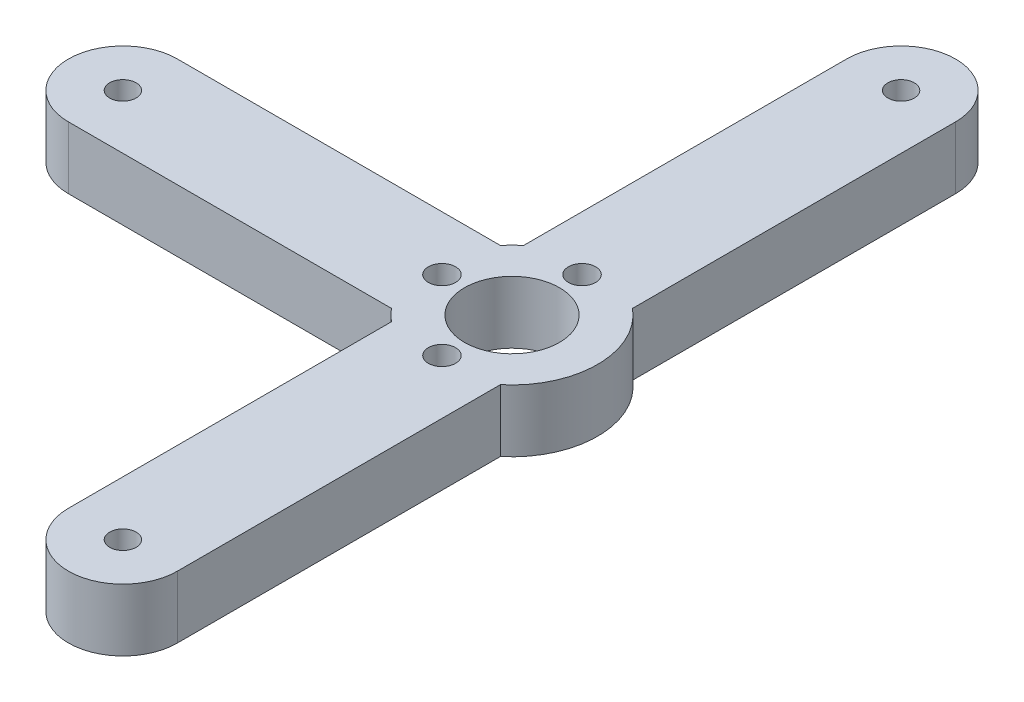
ISO-10303-21;
HEADER;
FILE_DESCRIPTION(('STEP AP214'),'2;1');
FILE_NAME('part.step','',(''),(''),'','','');
FILE_SCHEMA(('AUTOMOTIVE_DESIGN { 1 0 10303 214 1 1 1 1 }'));
ENDSEC;
DATA;
#1=APPLICATION_CONTEXT('core data for automotive mechanical design processes');
#2=APPLICATION_PROTOCOL_DEFINITION('international standard','automotive_design',2000,#1);
#3=PRODUCT_CONTEXT('',#1,'mechanical');
#4=PRODUCT('Part','Part','',(#3));
#5=PRODUCT_RELATED_PRODUCT_CATEGORY('part','',(#4));
#6=PRODUCT_DEFINITION_FORMATION('','',#4);
#7=PRODUCT_DEFINITION_CONTEXT('part definition',#1,'design');
#8=PRODUCT_DEFINITION('design','',#6,#7);
#9=PRODUCT_DEFINITION_SHAPE('','',#8);
#10=(LENGTH_UNIT() NAMED_UNIT(*) SI_UNIT(.MILLI.,.METRE.));
#11=(NAMED_UNIT(*) PLANE_ANGLE_UNIT() SI_UNIT($,.RADIAN.));
#12=(NAMED_UNIT(*) SI_UNIT($,.STERADIAN.) SOLID_ANGLE_UNIT());
#13=UNCERTAINTY_MEASURE_WITH_UNIT(LENGTH_MEASURE(1.E-05),#10,'distance_accuracy_value','');
#14=(GEOMETRIC_REPRESENTATION_CONTEXT(3) GLOBAL_UNCERTAINTY_ASSIGNED_CONTEXT((#13)) GLOBAL_UNIT_ASSIGNED_CONTEXT((#10,
#11,#12)) REPRESENTATION_CONTEXT('',''));
#15=CARTESIAN_POINT('',(0.,0.,0.));
#16=DIRECTION('',(0.,0.,1.));
#17=DIRECTION('',(1.,0.,0.));
#18=AXIS2_PLACEMENT_3D('',#15,#16,#17);
#19=CARTESIAN_POINT('',(-56.2916512459885,150.6,0.));
#20=DIRECTION('',(0.,-1.,0.));
#21=DIRECTION('',(0.,0.,-1.));
#22=AXIS2_PLACEMENT_3D('',#19,#20,#21);
#23=PLANE('',#22);
#24=CARTESIAN_POINT('',(-106.291651245989,150.6,0.));
#25=DIRECTION('',(0.,1.,0.));
#26=DIRECTION('',(0.,0.,1.));
#27=AXIS2_PLACEMENT_3D('',#24,#25,#26);
#28=CIRCLE('',#27,1.69999999999999);
#29=CARTESIAN_POINT('',(-106.291651245989,150.6,1.69999999999999));
#30=VERTEX_POINT('',#29);
#31=EDGE_CURVE('E200',#30,#30,#28,.T.);
#32=ORIENTED_EDGE('',*,*,#31,.T.);
#33=EDGE_LOOP('',(#32));
#34=FACE_BOUND('',#33,.T.);
#35=CARTESIAN_POINT('',(-106.291651245989,150.6,0.));
#36=DIRECTION('',(0.,1.,0.));
#37=DIRECTION('',(0.,0.,1.));
#38=AXIS2_PLACEMENT_3D('',#35,#36,#37);
#39=CIRCLE('',#38,3.10000000000001);
#40=CARTESIAN_POINT('',(-106.291651245989,150.6,3.10000000000001));
#41=VERTEX_POINT('',#40);
#42=EDGE_CURVE('E210',#41,#41,#39,.T.);
#43=ORIENTED_EDGE('',*,*,#42,.F.);
#44=EDGE_LOOP('',(#43));
#45=FACE_BOUND('',#44,.T.);
#46=ADVANCED_FACE('F41',(#34,#45),#23,.T.);
#47=CARTESIAN_POINT('',(-56.2916512459885,150.6,-50.));
#48=DIRECTION('',(0.,1.,0.));
#49=DIRECTION('',(0.,0.,1.));
#50=AXIS2_PLACEMENT_3D('',#47,#48,#49);
#51=CIRCLE('',#50,1.7);
#52=CARTESIAN_POINT('',(-56.2916512459885,150.6,-48.3));
#53=VERTEX_POINT('',#52);
#54=EDGE_CURVE('E198',#53,#53,#51,.T.);
#55=ORIENTED_EDGE('',*,*,#54,.T.);
#56=EDGE_LOOP('',(#55));
#57=FACE_BOUND('',#56,.T.);
#58=CARTESIAN_POINT('',(-56.2916512459885,150.6,-50.));
#59=DIRECTION('',(0.,1.,0.));
#60=DIRECTION('',(0.,0.,1.));
#61=AXIS2_PLACEMENT_3D('',#58,#59,#60);
#62=CIRCLE('',#61,3.1);
#63=CARTESIAN_POINT('',(-56.2916512459885,150.6,-46.9));
#64=VERTEX_POINT('',#63);
#65=EDGE_CURVE('E216',#64,#64,#62,.T.);
#66=ORIENTED_EDGE('',*,*,#65,.F.);
#67=EDGE_LOOP('',(#66));
#68=FACE_BOUND('',#67,.T.);
#69=ADVANCED_FACE('F329',(#57,#68),#23,.T.);
#70=CARTESIAN_POINT('',(-56.2916512459885,150.6,50.));
#71=DIRECTION('',(0.,1.,0.));
#72=DIRECTION('',(0.,0.,1.));
#73=AXIS2_PLACEMENT_3D('',#70,#71,#72);
#74=CIRCLE('',#73,1.7);
#75=CARTESIAN_POINT('',(-56.2916512459885,150.6,51.7));
#76=VERTEX_POINT('',#75);
#77=EDGE_CURVE('E193',#76,#76,#74,.T.);
#78=ORIENTED_EDGE('',*,*,#77,.T.);
#79=EDGE_LOOP('',(#78));
#80=FACE_BOUND('',#79,.T.);
#81=CARTESIAN_POINT('',(-56.2916512459885,150.6,50.));
#82=DIRECTION('',(0.,1.,0.));
#83=DIRECTION('',(0.,0.,1.));
#84=AXIS2_PLACEMENT_3D('',#81,#82,#83);
#85=CIRCLE('',#84,3.1);
#86=CARTESIAN_POINT('',(-56.2916512459885,150.6,53.1));
#87=VERTEX_POINT('',#86);
#88=EDGE_CURVE('E205',#87,#87,#85,.T.);
#89=ORIENTED_EDGE('',*,*,#88,.F.);
#90=EDGE_LOOP('',(#89));
#91=FACE_BOUND('',#90,.T.);
#92=ADVANCED_FACE('F334',(#80,#91),#23,.T.);
#93=CARTESIAN_POINT('',(-106.291651245989,153.,0.));
#94=DIRECTION('',(0.,-1.,0.));
#95=DIRECTION('',(0.,0.,-1.));
#96=AXIS2_PLACEMENT_3D('',#93,#94,#95);
#97=CYLINDRICAL_SURFACE('',#96,1.69999999999999);
#98=ORIENTED_EDGE('',*,*,#31,.F.);
#99=EDGE_LOOP('',(#98));
#100=FACE_BOUND('',#99,.T.);
#101=CARTESIAN_POINT('',(-106.291651245989,157.,0.));
#102=DIRECTION('',(0.,1.,0.));
#103=DIRECTION('',(0.,0.,1.));
#104=AXIS2_PLACEMENT_3D('',#101,#102,#103);
#105=CIRCLE('',#104,1.69999999999999);
#106=CARTESIAN_POINT('',(-106.291651245989,157.,1.69999999999999));
#107=VERTEX_POINT('',#106);
#108=EDGE_CURVE('E155',#107,#107,#105,.T.);
#109=ORIENTED_EDGE('',*,*,#108,.T.);
#110=EDGE_LOOP('',(#109));
#111=FACE_BOUND('',#110,.T.);
#112=ADVANCED_FACE('F343',(#100,#111),#97,.F.);
#113=CARTESIAN_POINT('',(-56.2916512459885,153.,-50.));
#114=DIRECTION('',(0.,-1.,0.));
#115=DIRECTION('',(0.,0.,-1.));
#116=AXIS2_PLACEMENT_3D('',#113,#114,#115);
#117=CYLINDRICAL_SURFACE('',#116,1.7);
#118=ORIENTED_EDGE('',*,*,#54,.F.);
#119=EDGE_LOOP('',(#118));
#120=FACE_BOUND('',#119,.T.);
#121=CARTESIAN_POINT('',(-56.2916512459885,157.,-50.));
#122=DIRECTION('',(0.,1.,0.));
#123=DIRECTION('',(0.,0.,1.));
#124=AXIS2_PLACEMENT_3D('',#121,#122,#123);
#125=CIRCLE('',#124,1.7);
#126=CARTESIAN_POINT('',(-56.2916512459885,157.,-48.3));
#127=VERTEX_POINT('',#126);
#128=EDGE_CURVE('E154',#127,#127,#125,.T.);
#129=ORIENTED_EDGE('',*,*,#128,.T.);
#130=EDGE_LOOP('',(#129));
#131=FACE_BOUND('',#130,.T.);
#132=ADVANCED_FACE('F349',(#120,#131),#117,.F.);
#133=CARTESIAN_POINT('',(-56.2916512459885,153.,50.));
#134=DIRECTION('',(0.,-1.,0.));
#135=DIRECTION('',(0.,0.,-1.));
#136=AXIS2_PLACEMENT_3D('',#133,#134,#135);
#137=CYLINDRICAL_SURFACE('',#136,1.7);
#138=ORIENTED_EDGE('',*,*,#77,.F.);
#139=EDGE_LOOP('',(#138));
#140=FACE_BOUND('',#139,.T.);
#141=CARTESIAN_POINT('',(-56.2916512459885,157.,50.));
#142=DIRECTION('',(0.,1.,0.));
#143=DIRECTION('',(0.,0.,1.));
#144=AXIS2_PLACEMENT_3D('',#141,#142,#143);
#145=CIRCLE('',#144,1.7);
#146=CARTESIAN_POINT('',(-56.2916512459885,157.,51.7));
#147=VERTEX_POINT('',#146);
#148=EDGE_CURVE('E420',#147,#147,#145,.T.);
#149=ORIENTED_EDGE('',*,*,#148,.T.);
#150=EDGE_LOOP('',(#149));
#151=FACE_BOUND('',#150,.T.);
#152=ADVANCED_FACE('F324',(#140,#151),#137,.F.);
#153=CARTESIAN_POINT('',(-106.291651245989,150.,0.));
#154=DIRECTION('',(0.,-1.,0.));
#155=DIRECTION('',(0.,0.,-1.));
#156=AXIS2_PLACEMENT_3D('',#153,#154,#155);
#157=CYLINDRICAL_SURFACE('',#156,3.10000000000001);
#158=CARTESIAN_POINT('',(-106.291651245989,149.,0.));
#159=DIRECTION('',(0.,1.,0.));
#160=DIRECTION('',(0.,0.,1.));
#161=AXIS2_PLACEMENT_3D('',#158,#159,#160);
#162=CIRCLE('',#161,3.10000000000001);
#163=CARTESIAN_POINT('',(-106.291651245989,149.,3.10000000000001));
#164=VERTEX_POINT('',#163);
#165=EDGE_CURVE('E228',#164,#164,#162,.T.);
#166=ORIENTED_EDGE('',*,*,#165,.F.);
#167=EDGE_LOOP('',(#166));
#168=FACE_BOUND('',#167,.T.);
#169=ORIENTED_EDGE('',*,*,#42,.T.);
#170=EDGE_LOOP('',(#169));
#171=FACE_BOUND('',#170,.T.);
#172=ADVANCED_FACE('F320',(#168,#171),#157,.F.);
#173=CARTESIAN_POINT('',(-64.776932620227,150.,7.));
#174=DIRECTION('',(0.,0.,-1.));
#175=DIRECTION('',(-1.,0.,0.));
#176=AXIS2_PLACEMENT_3D('',#173,#174,#175);
#177=PLANE('',#176);
#178=DIRECTION('',(1.,0.,0.));
#179=VECTOR('',#178,1.);
#180=CARTESIAN_POINT('',(-64.776932620227,149.,7.));
#181=LINE('',#180,#179);
#182=CARTESIAN_POINT('',(-106.291651245989,149.,7.));
#183=VERTEX_POINT('',#182);
#184=CARTESIAN_POINT('',(-64.776932620227,149.,7.));
#185=VERTEX_POINT('',#184);
#186=EDGE_CURVE('E57',#183,#185,#181,.T.);
#187=ORIENTED_EDGE('',*,*,#186,.T.);
#188=DIRECTION('',(0.,-1.,0.));
#189=VECTOR('',#188,1.);
#190=CARTESIAN_POINT('',(-64.776932620227,150.,7.));
#191=LINE('',#190,#189);
#192=CARTESIAN_POINT('',(-64.776932620227,157.,7.));
#193=VERTEX_POINT('',#192);
#194=EDGE_CURVE('E251',#193,#185,#191,.T.);
#195=ORIENTED_EDGE('',*,*,#194,.F.);
#196=DIRECTION('',(1.,0.,0.));
#197=VECTOR('',#196,1.);
#198=CARTESIAN_POINT('',(-64.776932620227,157.,7.));
#199=LINE('',#198,#197);
#200=CARTESIAN_POINT('',(-106.291651245989,157.,7.));
#201=VERTEX_POINT('',#200);
#202=EDGE_CURVE('E151',#201,#193,#199,.T.);
#203=ORIENTED_EDGE('',*,*,#202,.F.);
#204=DIRECTION('',(0.,-1.,0.));
#205=VECTOR('',#204,1.);
#206=CARTESIAN_POINT('',(-106.291651245989,150.,7.));
#207=LINE('',#206,#205);
#208=EDGE_CURVE('E254',#201,#183,#207,.T.);
#209=ORIENTED_EDGE('',*,*,#208,.T.);
#210=EDGE_LOOP('',(#187,#195,#203,#209));
#211=FACE_BOUND('',#210,.T.);
#212=ADVANCED_FACE('F312',(#211),#177,.F.);
#213=CARTESIAN_POINT('',(-106.291651245989,150.,0.));
#214=DIRECTION('',(0.,-1.,0.));
#215=DIRECTION('',(0.,0.,-1.));
#216=AXIS2_PLACEMENT_3D('',#213,#214,#215);
#217=CYLINDRICAL_SURFACE('',#216,7.);
#218=CARTESIAN_POINT('',(-106.291651245989,149.,0.));
#219=DIRECTION('',(0.,1.,0.));
#220=DIRECTION('',(0.,0.,-1.));
#221=AXIS2_PLACEMENT_3D('',#218,#219,#220);
#222=CIRCLE('',#221,7.);
#223=CARTESIAN_POINT('',(-106.291651245989,149.,-7.));
#224=VERTEX_POINT('',#223);
#225=EDGE_CURVE('E64',#224,#183,#222,.T.);
#226=ORIENTED_EDGE('',*,*,#225,.T.);
#227=ORIENTED_EDGE('',*,*,#208,.F.);
#228=CARTESIAN_POINT('',(-106.291651245989,157.,0.));
#229=DIRECTION('',(0.,1.,0.));
#230=DIRECTION('',(0.,0.,-1.));
#231=AXIS2_PLACEMENT_3D('',#228,#229,#230);
#232=CIRCLE('',#231,7.);
#233=CARTESIAN_POINT('',(-106.291651245989,157.,-7.));
#234=VERTEX_POINT('',#233);
#235=EDGE_CURVE('E182',#234,#201,#232,.T.);
#236=ORIENTED_EDGE('',*,*,#235,.F.);
#237=DIRECTION('',(0.,-1.,0.));
#238=VECTOR('',#237,1.);
#239=CARTESIAN_POINT('',(-106.291651245989,150.,-7.));
#240=LINE('',#239,#238);
#241=EDGE_CURVE('E260',#234,#224,#240,.T.);
#242=ORIENTED_EDGE('',*,*,#241,.T.);
#243=EDGE_LOOP('',(#226,#227,#236,#242));
#244=FACE_BOUND('',#243,.T.);
#245=ADVANCED_FACE('F314',(#244),#217,.T.);
#246=CARTESIAN_POINT('',(-106.291651245988,150.,-7.));
#247=DIRECTION('',(0.,0.,1.));
#248=DIRECTION('',(1.,0.,0.));
#249=AXIS2_PLACEMENT_3D('',#246,#247,#248);
#250=PLANE('',#249);
#251=DIRECTION('',(-1.,0.,0.));
#252=VECTOR('',#251,1.);
#253=CARTESIAN_POINT('',(-106.291651245988,149.,-7.));
#254=LINE('',#253,#252);
#255=CARTESIAN_POINT('',(-64.7769326202271,149.,-7.));
#256=VERTEX_POINT('',#255);
#257=EDGE_CURVE('E249',#256,#224,#254,.T.);
#258=ORIENTED_EDGE('',*,*,#257,.T.);
#259=ORIENTED_EDGE('',*,*,#241,.F.);
#260=DIRECTION('',(-1.,0.,0.));
#261=VECTOR('',#260,1.);
#262=CARTESIAN_POINT('',(-106.291651245988,157.,-7.));
#263=LINE('',#262,#261);
#264=CARTESIAN_POINT('',(-64.7769326202271,157.,-7.));
#265=VERTEX_POINT('',#264);
#266=EDGE_CURVE('E178',#265,#234,#263,.T.);
#267=ORIENTED_EDGE('',*,*,#266,.F.);
#268=DIRECTION('',(0.,-1.,0.));
#269=VECTOR('',#268,1.);
#270=CARTESIAN_POINT('',(-64.7769326202271,150.,-7.));
#271=LINE('',#270,#269);
#272=EDGE_CURVE('E259',#265,#256,#271,.T.);
#273=ORIENTED_EDGE('',*,*,#272,.T.);
#274=EDGE_LOOP('',(#258,#259,#267,#273));
#275=FACE_BOUND('',#274,.T.);
#276=ADVANCED_FACE('F311',(#275),#250,.F.);
#277=CARTESIAN_POINT('',(-56.2916512459885,150.,0.));
#278=DIRECTION('',(0.,-1.,0.));
#279=DIRECTION('',(0.,0.,-1.));
#280=AXIS2_PLACEMENT_3D('',#277,#278,#279);
#281=CYLINDRICAL_SURFACE('',#280,11.);
#282=CARTESIAN_POINT('',(-56.2916512459885,149.,0.));
#283=DIRECTION('',(0.,1.,0.));
#284=DIRECTION('',(0.,0.,-1.));
#285=AXIS2_PLACEMENT_3D('',#282,#283,#284);
#286=CIRCLE('',#285,11.);
#287=CARTESIAN_POINT('',(-63.2916512459881,149.,-8.48528137423894));
#288=VERTEX_POINT('',#287);
#289=EDGE_CURVE('E250',#288,#256,#286,.T.);
#290=ORIENTED_EDGE('',*,*,#289,.T.);
#291=ORIENTED_EDGE('',*,*,#272,.F.);
#292=CARTESIAN_POINT('',(-56.2916512459885,157.,0.));
#293=DIRECTION('',(0.,1.,0.));
#294=DIRECTION('',(0.,0.,-1.));
#295=AXIS2_PLACEMENT_3D('',#292,#293,#294);
#296=CIRCLE('',#295,11.);
#297=CARTESIAN_POINT('',(-63.2916512459881,157.,-8.48528137423894));
#298=VERTEX_POINT('',#297);
#299=EDGE_CURVE('E172',#298,#265,#296,.T.);
#300=ORIENTED_EDGE('',*,*,#299,.F.);
#301=DIRECTION('',(0.,-1.,0.));
#302=VECTOR('',#301,1.);
#303=CARTESIAN_POINT('',(-63.2916512459881,150.,-8.48528137423894));
#304=LINE('',#303,#302);
#305=EDGE_CURVE('E265',#298,#288,#304,.T.);
#306=ORIENTED_EDGE('',*,*,#305,.T.);
#307=EDGE_LOOP('',(#290,#291,#300,#306));
#308=FACE_BOUND('',#307,.T.);
#309=ADVANCED_FACE('F310',(#308),#281,.T.);
#310=CARTESIAN_POINT('',(-63.2916512459881,150.,-8.48528137423894));
#311=DIRECTION('',(1.,0.,0.));
#312=DIRECTION('',(0.,0.,-1.));
#313=AXIS2_PLACEMENT_3D('',#310,#311,#312);
#314=PLANE('',#313);
#315=DIRECTION('',(0.,0.,1.));
#316=VECTOR('',#315,1.);
#317=CARTESIAN_POINT('',(-63.2916512459881,149.,-8.48528137423894));
#318=LINE('',#317,#316);
#319=CARTESIAN_POINT('',(-63.2916512459885,149.,-50.));
#320=VERTEX_POINT('',#319);
#321=EDGE_CURVE('E242',#320,#288,#318,.T.);
#322=ORIENTED_EDGE('',*,*,#321,.T.);
#323=ORIENTED_EDGE('',*,*,#305,.F.);
#324=DIRECTION('',(0.,0.,1.));
#325=VECTOR('',#324,1.);
#326=CARTESIAN_POINT('',(-63.2916512459881,157.,-8.48528137423894));
#327=LINE('',#326,#325);
#328=CARTESIAN_POINT('',(-63.2916512459885,157.,-50.));
#329=VERTEX_POINT('',#328);
#330=EDGE_CURVE('E175',#329,#298,#327,.T.);
#331=ORIENTED_EDGE('',*,*,#330,.F.);
#332=DIRECTION('',(0.,-1.,0.));
#333=VECTOR('',#332,1.);
#334=CARTESIAN_POINT('',(-63.2916512459885,150.,-50.));
#335=LINE('',#334,#333);
#336=EDGE_CURVE('E264',#329,#320,#335,.T.);
#337=ORIENTED_EDGE('',*,*,#336,.T.);
#338=EDGE_LOOP('',(#322,#323,#331,#337));
#339=FACE_BOUND('',#338,.T.);
#340=ADVANCED_FACE('F301',(#339),#314,.F.);
#341=CARTESIAN_POINT('',(-56.2916512459885,150.,-50.));
#342=DIRECTION('',(0.,-1.,0.));
#343=DIRECTION('',(0.,0.,-1.));
#344=AXIS2_PLACEMENT_3D('',#341,#342,#343);
#345=CYLINDRICAL_SURFACE('',#344,7.);
#346=CARTESIAN_POINT('',(-56.2916512459885,149.,-50.));
#347=DIRECTION('',(0.,1.,0.));
#348=DIRECTION('',(0.,0.,-1.));
#349=AXIS2_PLACEMENT_3D('',#346,#347,#348);
#350=CIRCLE('',#349,7.);
#351=CARTESIAN_POINT('',(-49.2916512459885,149.,-50.));
#352=VERTEX_POINT('',#351);
#353=EDGE_CURVE('E241',#352,#320,#350,.T.);
#354=ORIENTED_EDGE('',*,*,#353,.T.);
#355=ORIENTED_EDGE('',*,*,#336,.F.);
#356=CARTESIAN_POINT('',(-56.2916512459885,157.,-50.));
#357=DIRECTION('',(0.,1.,0.));
#358=DIRECTION('',(0.,0.,-1.));
#359=AXIS2_PLACEMENT_3D('',#356,#357,#358);
#360=CIRCLE('',#359,7.);
#361=CARTESIAN_POINT('',(-49.2916512459885,157.,-50.));
#362=VERTEX_POINT('',#361);
#363=EDGE_CURVE('E166',#362,#329,#360,.T.);
#364=ORIENTED_EDGE('',*,*,#363,.F.);
#365=DIRECTION('',(0.,-1.,0.));
#366=VECTOR('',#365,1.);
#367=CARTESIAN_POINT('',(-49.2916512459885,150.,-50.));
#368=LINE('',#367,#366);
#369=EDGE_CURVE('E268',#362,#352,#368,.T.);
#370=ORIENTED_EDGE('',*,*,#369,.T.);
#371=EDGE_LOOP('',(#354,#355,#364,#370));
#372=FACE_BOUND('',#371,.T.);
#373=ADVANCED_FACE('F297',(#372),#345,.T.);
#374=CARTESIAN_POINT('',(-49.2916512459885,150.,-50.));
#375=DIRECTION('',(-1.,0.,0.));
#376=DIRECTION('',(0.,0.,1.));
#377=AXIS2_PLACEMENT_3D('',#374,#375,#376);
#378=PLANE('',#377);
#379=DIRECTION('',(0.,0.,-1.));
#380=VECTOR('',#379,1.);
#381=CARTESIAN_POINT('',(-49.2916512459885,149.,-50.));
#382=LINE('',#381,#380);
#383=CARTESIAN_POINT('',(-49.2916512459885,149.,-8.48528137423857));
#384=VERTEX_POINT('',#383);
#385=EDGE_CURVE('E243',#384,#352,#382,.T.);
#386=ORIENTED_EDGE('',*,*,#385,.T.);
#387=ORIENTED_EDGE('',*,*,#369,.F.);
#388=DIRECTION('',(0.,0.,-1.));
#389=VECTOR('',#388,1.);
#390=CARTESIAN_POINT('',(-49.2916512459885,157.,-50.));
#391=LINE('',#390,#389);
#392=CARTESIAN_POINT('',(-49.2916512459885,157.,-8.48528137423857));
#393=VERTEX_POINT('',#392);
#394=EDGE_CURVE('E167',#393,#362,#391,.T.);
#395=ORIENTED_EDGE('',*,*,#394,.F.);
#396=DIRECTION('',(0.,-1.,0.));
#397=VECTOR('',#396,1.);
#398=CARTESIAN_POINT('',(-49.2916512459885,150.,-8.48528137423857));
#399=LINE('',#398,#397);
#400=EDGE_CURVE('E271',#393,#384,#399,.T.);
#401=ORIENTED_EDGE('',*,*,#400,.T.);
#402=EDGE_LOOP('',(#386,#387,#395,#401));
#403=FACE_BOUND('',#402,.T.);
#404=ADVANCED_FACE('F300',(#403),#378,.F.);
#405=CARTESIAN_POINT('',(-56.2916512459885,150.,0.));
#406=DIRECTION('',(0.,-1.,0.));
#407=DIRECTION('',(0.,0.,-1.));
#408=AXIS2_PLACEMENT_3D('',#405,#406,#407);
#409=CYLINDRICAL_SURFACE('',#408,11.);
#410=CARTESIAN_POINT('',(-56.2916512459885,149.,0.));
#411=DIRECTION('',(0.,1.,0.));
#412=DIRECTION('',(0.,0.,-1.));
#413=AXIS2_PLACEMENT_3D('',#410,#411,#412);
#414=CIRCLE('',#413,11.);
#415=CARTESIAN_POINT('',(-49.2916512459885,149.,8.48528137423857));
#416=VERTEX_POINT('',#415);
#417=EDGE_CURVE('E239',#416,#384,#414,.T.);
#418=ORIENTED_EDGE('',*,*,#417,.T.);
#419=ORIENTED_EDGE('',*,*,#400,.F.);
#420=CARTESIAN_POINT('',(-56.2916512459885,157.,0.));
#421=DIRECTION('',(0.,1.,0.));
#422=DIRECTION('',(0.,0.,-1.));
#423=AXIS2_PLACEMENT_3D('',#420,#421,#422);
#424=CIRCLE('',#423,11.);
#425=CARTESIAN_POINT('',(-49.2916512459885,157.,8.48528137423857));
#426=VERTEX_POINT('',#425);
#427=EDGE_CURVE('E162',#426,#393,#424,.T.);
#428=ORIENTED_EDGE('',*,*,#427,.F.);
#429=DIRECTION('',(0.,-1.,0.));
#430=VECTOR('',#429,1.);
#431=CARTESIAN_POINT('',(-49.2916512459885,150.,8.48528137423857));
#432=LINE('',#431,#430);
#433=EDGE_CURVE('E273',#426,#416,#432,.T.);
#434=ORIENTED_EDGE('',*,*,#433,.T.);
#435=EDGE_LOOP('',(#418,#419,#428,#434));
#436=FACE_BOUND('',#435,.T.);
#437=ADVANCED_FACE('F291',(#436),#409,.T.);
#438=CARTESIAN_POINT('',(-49.2916512459885,150.,8.48528137423857));
#439=DIRECTION('',(-1.,0.,0.));
#440=DIRECTION('',(0.,0.,1.));
#441=AXIS2_PLACEMENT_3D('',#438,#439,#440);
#442=PLANE('',#441);
#443=DIRECTION('',(0.,0.,-1.));
#444=VECTOR('',#443,1.);
#445=CARTESIAN_POINT('',(-49.2916512459885,149.,8.48528137423857));
#446=LINE('',#445,#444);
#447=CARTESIAN_POINT('',(-49.2916512459885,149.,50.));
#448=VERTEX_POINT('',#447);
#449=EDGE_CURVE('E240',#448,#416,#446,.T.);
#450=ORIENTED_EDGE('',*,*,#449,.T.);
#451=ORIENTED_EDGE('',*,*,#433,.F.);
#452=DIRECTION('',(0.,0.,-1.));
#453=VECTOR('',#452,1.);
#454=CARTESIAN_POINT('',(-49.2916512459885,157.,8.48528137423857));
#455=LINE('',#454,#453);
#456=CARTESIAN_POINT('',(-49.2916512459885,157.,50.));
#457=VERTEX_POINT('',#456);
#458=EDGE_CURVE('E159',#457,#426,#455,.T.);
#459=ORIENTED_EDGE('',*,*,#458,.F.);
#460=DIRECTION('',(0.,-1.,0.));
#461=VECTOR('',#460,1.);
#462=CARTESIAN_POINT('',(-49.2916512459885,150.,50.));
#463=LINE('',#462,#461);
#464=EDGE_CURVE('E280',#457,#448,#463,.T.);
#465=ORIENTED_EDGE('',*,*,#464,.T.);
#466=EDGE_LOOP('',(#450,#451,#459,#465));
#467=FACE_BOUND('',#466,.T.);
#468=ADVANCED_FACE('F289',(#467),#442,.F.);
#469=CARTESIAN_POINT('',(-56.2916512459885,150.,50.));
#470=DIRECTION('',(0.,-1.,0.));
#471=DIRECTION('',(0.,0.,-1.));
#472=AXIS2_PLACEMENT_3D('',#469,#470,#471);
#473=CYLINDRICAL_SURFACE('',#472,7.);
#474=CARTESIAN_POINT('',(-56.2916512459885,149.,50.));
#475=DIRECTION('',(0.,1.,0.));
#476=DIRECTION('',(0.,0.,-1.));
#477=AXIS2_PLACEMENT_3D('',#474,#475,#476);
#478=CIRCLE('',#477,7.);
#479=CARTESIAN_POINT('',(-63.2916512459885,149.,50.));
#480=VERTEX_POINT('',#479);
#481=EDGE_CURVE('E231',#480,#448,#478,.T.);
#482=ORIENTED_EDGE('',*,*,#481,.T.);
#483=ORIENTED_EDGE('',*,*,#464,.F.);
#484=CARTESIAN_POINT('',(-56.2916512459885,157.,50.));
#485=DIRECTION('',(0.,1.,0.));
#486=DIRECTION('',(0.,0.,-1.));
#487=AXIS2_PLACEMENT_3D('',#484,#485,#486);
#488=CIRCLE('',#487,7.);
#489=CARTESIAN_POINT('',(-63.2916512459885,157.,50.));
#490=VERTEX_POINT('',#489);
#491=EDGE_CURVE('E145',#490,#457,#488,.T.);
#492=ORIENTED_EDGE('',*,*,#491,.F.);
#493=DIRECTION('',(0.,-1.,0.));
#494=VECTOR('',#493,1.);
#495=CARTESIAN_POINT('',(-63.2916512459885,150.,50.));
#496=LINE('',#495,#494);
#497=EDGE_CURVE('E47',#490,#480,#496,.T.);
#498=ORIENTED_EDGE('',*,*,#497,.T.);
#499=EDGE_LOOP('',(#482,#483,#492,#498));
#500=FACE_BOUND('',#499,.T.);
#501=ADVANCED_FACE('F283',(#500),#473,.T.);
#502=CARTESIAN_POINT('',(-63.2916512459885,150.,50.));
#503=DIRECTION('',(1.,0.,0.));
#504=DIRECTION('',(0.,0.,-1.));
#505=AXIS2_PLACEMENT_3D('',#502,#503,#504);
#506=PLANE('',#505);
#507=DIRECTION('',(0.,0.,1.));
#508=VECTOR('',#507,1.);
#509=CARTESIAN_POINT('',(-63.2916512459885,149.,50.));
#510=LINE('',#509,#508);
#511=CARTESIAN_POINT('',(-63.2916512459881,149.,8.48528137423894));
#512=VERTEX_POINT('',#511);
#513=EDGE_CURVE('E233',#512,#480,#510,.T.);
#514=ORIENTED_EDGE('',*,*,#513,.T.);
#515=ORIENTED_EDGE('',*,*,#497,.F.);
#516=DIRECTION('',(0.,0.,1.));
#517=VECTOR('',#516,1.);
#518=CARTESIAN_POINT('',(-63.2916512459885,157.,50.));
#519=LINE('',#518,#517);
#520=CARTESIAN_POINT('',(-63.2916512459881,157.,8.48528137423894));
#521=VERTEX_POINT('',#520);
#522=EDGE_CURVE('E138',#521,#490,#519,.T.);
#523=ORIENTED_EDGE('',*,*,#522,.F.);
#524=DIRECTION('',(0.,-1.,0.));
#525=VECTOR('',#524,1.);
#526=CARTESIAN_POINT('',(-63.2916512459881,150.,8.48528137423894));
#527=LINE('',#526,#525);
#528=EDGE_CURVE('E11',#521,#512,#527,.T.);
#529=ORIENTED_EDGE('',*,*,#528,.T.);
#530=EDGE_LOOP('',(#514,#515,#523,#529));
#531=FACE_BOUND('',#530,.T.);
#532=ADVANCED_FACE('F139',(#531),#506,.F.);
#533=CARTESIAN_POINT('',(-56.2916512459885,150.,0.));
#534=DIRECTION('',(0.,-1.,0.));
#535=DIRECTION('',(0.,0.,-1.));
#536=AXIS2_PLACEMENT_3D('',#533,#534,#535);
#537=CYLINDRICAL_SURFACE('',#536,11.);
#538=CARTESIAN_POINT('',(-56.2916512459885,149.,0.));
#539=DIRECTION('',(0.,1.,0.));
#540=DIRECTION('',(0.,0.,-1.));
#541=AXIS2_PLACEMENT_3D('',#538,#539,#540);
#542=CIRCLE('',#541,11.);
#543=EDGE_CURVE('E132',#185,#512,#542,.T.);
#544=ORIENTED_EDGE('',*,*,#543,.T.);
#545=ORIENTED_EDGE('',*,*,#528,.F.);
#546=CARTESIAN_POINT('',(-56.2916512459885,157.,0.));
#547=DIRECTION('',(0.,1.,0.));
#548=DIRECTION('',(0.,0.,-1.));
#549=AXIS2_PLACEMENT_3D('',#546,#547,#548);
#550=CIRCLE('',#549,11.);
#551=EDGE_CURVE('E131',#193,#521,#550,.T.);
#552=ORIENTED_EDGE('',*,*,#551,.F.);
#553=ORIENTED_EDGE('',*,*,#194,.T.);
#554=EDGE_LOOP('',(#544,#545,#552,#553));
#555=FACE_BOUND('',#554,.T.);
#556=ADVANCED_FACE('F43',(#555),#537,.T.);
#557=CARTESIAN_POINT('',(-56.2916512459885,150.,0.));
#558=DIRECTION('',(0.,-1.,0.));
#559=DIRECTION('',(0.,0.,-1.));
#560=AXIS2_PLACEMENT_3D('',#557,#558,#559);
#561=CYLINDRICAL_SURFACE('',#560,6.1);
#562=CARTESIAN_POINT('',(-56.2916512459885,149.,0.));
#563=DIRECTION('',(0.,1.,0.));
#564=DIRECTION('',(0.,0.,1.));
#565=AXIS2_PLACEMENT_3D('',#562,#563,#564);
#566=CIRCLE('',#565,6.1);
#567=CARTESIAN_POINT('',(-56.2916512459885,149.,6.1));
#568=VERTEX_POINT('',#567);
#569=EDGE_CURVE('E229',#568,#568,#566,.T.);
#570=ORIENTED_EDGE('',*,*,#569,.F.);
#571=EDGE_LOOP('',(#570));
#572=FACE_BOUND('',#571,.T.);
#573=CARTESIAN_POINT('',(-56.2916512459885,157.,0.));
#574=DIRECTION('',(0.,1.,0.));
#575=DIRECTION('',(0.,0.,1.));
#576=AXIS2_PLACEMENT_3D('',#573,#574,#575);
#577=CIRCLE('',#576,6.1);
#578=CARTESIAN_POINT('',(-56.2916512459885,157.,6.1));
#579=VERTEX_POINT('',#578);
#580=EDGE_CURVE('E425',#579,#579,#577,.T.);
#581=ORIENTED_EDGE('',*,*,#580,.T.);
#582=EDGE_LOOP('',(#581));
#583=FACE_BOUND('',#582,.T.);
#584=ADVANCED_FACE('F374',(#572,#583),#561,.F.);
#585=CARTESIAN_POINT('',(-56.2916512459885,150.,-50.));
#586=DIRECTION('',(0.,-1.,0.));
#587=DIRECTION('',(0.,0.,-1.));
#588=AXIS2_PLACEMENT_3D('',#585,#586,#587);
#589=CYLINDRICAL_SURFACE('',#588,3.1);
#590=CARTESIAN_POINT('',(-56.2916512459885,149.,-50.));
#591=DIRECTION('',(0.,1.,0.));
#592=DIRECTION('',(0.,0.,1.));
#593=AXIS2_PLACEMENT_3D('',#590,#591,#592);
#594=CIRCLE('',#593,3.1);
#595=CARTESIAN_POINT('',(-56.2916512459885,149.,-46.9));
#596=VERTEX_POINT('',#595);
#597=EDGE_CURVE('E224',#596,#596,#594,.T.);
#598=ORIENTED_EDGE('',*,*,#597,.F.);
#599=EDGE_LOOP('',(#598));
#600=FACE_BOUND('',#599,.T.);
#601=ORIENTED_EDGE('',*,*,#65,.T.);
#602=EDGE_LOOP('',(#601));
#603=FACE_BOUND('',#602,.T.);
#604=ADVANCED_FACE('F366',(#600,#603),#589,.F.);
#605=CARTESIAN_POINT('',(-56.2916512459885,149.,0.));
#606=DIRECTION('',(0.,-1.,0.));
#607=DIRECTION('',(0.,0.,-1.));
#608=AXIS2_PLACEMENT_3D('',#605,#606,#607);
#609=PLANE('',#608);
#610=ORIENTED_EDGE('',*,*,#597,.T.);
#611=EDGE_LOOP('',(#610));
#612=FACE_BOUND('',#611,.T.);
#613=ORIENTED_EDGE('',*,*,#569,.T.);
#614=EDGE_LOOP('',(#613));
#615=FACE_BOUND('',#614,.T.);
#616=ORIENTED_EDGE('',*,*,#543,.F.);
#617=ORIENTED_EDGE('',*,*,#186,.F.);
#618=ORIENTED_EDGE('',*,*,#225,.F.);
#619=ORIENTED_EDGE('',*,*,#257,.F.);
#620=ORIENTED_EDGE('',*,*,#289,.F.);
#621=ORIENTED_EDGE('',*,*,#321,.F.);
#622=ORIENTED_EDGE('',*,*,#353,.F.);
#623=ORIENTED_EDGE('',*,*,#385,.F.);
#624=ORIENTED_EDGE('',*,*,#417,.F.);
#625=ORIENTED_EDGE('',*,*,#449,.F.);
#626=ORIENTED_EDGE('',*,*,#481,.F.);
#627=ORIENTED_EDGE('',*,*,#513,.F.);
#628=EDGE_LOOP('',(#616,#617,#618,#619,#620,#621,#622,#623,#624,#625,#626,#627));
#629=FACE_BOUND('',#628,.T.);
#630=ORIENTED_EDGE('',*,*,#165,.T.);
#631=EDGE_LOOP('',(#630));
#632=FACE_BOUND('',#631,.T.);
#633=CARTESIAN_POINT('',(-56.2916512459885,149.,50.));
#634=DIRECTION('',(0.,1.,0.));
#635=DIRECTION('',(0.,0.,1.));
#636=AXIS2_PLACEMENT_3D('',#633,#634,#635);
#637=CIRCLE('',#636,3.1);
#638=CARTESIAN_POINT('',(-56.2916512459885,149.,53.1));
#639=VERTEX_POINT('',#638);
#640=EDGE_CURVE('E213',#639,#639,#637,.T.);
#641=ORIENTED_EDGE('',*,*,#640,.T.);
#642=EDGE_LOOP('',(#641));
#643=FACE_BOUND('',#642,.T.);
#644=ADVANCED_FACE('F284',(#612,#615,#629,#632,#643),#609,.T.);
#645=CARTESIAN_POINT('',(-56.2916512459885,150.,50.));
#646=DIRECTION('',(0.,-1.,0.));
#647=DIRECTION('',(0.,0.,-1.));
#648=AXIS2_PLACEMENT_3D('',#645,#646,#647);
#649=CYLINDRICAL_SURFACE('',#648,3.1);
#650=ORIENTED_EDGE('',*,*,#640,.F.);
#651=EDGE_LOOP('',(#650));
#652=FACE_BOUND('',#651,.T.);
#653=ORIENTED_EDGE('',*,*,#88,.T.);
#654=EDGE_LOOP('',(#653));
#655=FACE_BOUND('',#654,.T.);
#656=ADVANCED_FACE('F357',(#652,#655),#649,.F.);
#657=CARTESIAN_POINT('',(-56.2916512459885,157.,0.));
#658=DIRECTION('',(0.,-1.,0.));
#659=DIRECTION('',(0.,0.,-1.));
#660=AXIS2_PLACEMENT_3D('',#657,#658,#659);
#661=PLANE('',#660);
#662=ORIENTED_EDGE('',*,*,#551,.T.);
#663=ORIENTED_EDGE('',*,*,#522,.T.);
#664=ORIENTED_EDGE('',*,*,#491,.T.);
#665=ORIENTED_EDGE('',*,*,#458,.T.);
#666=ORIENTED_EDGE('',*,*,#427,.T.);
#667=ORIENTED_EDGE('',*,*,#394,.T.);
#668=ORIENTED_EDGE('',*,*,#363,.T.);
#669=ORIENTED_EDGE('',*,*,#330,.T.);
#670=ORIENTED_EDGE('',*,*,#299,.T.);
#671=ORIENTED_EDGE('',*,*,#266,.T.);
#672=ORIENTED_EDGE('',*,*,#235,.T.);
#673=ORIENTED_EDGE('',*,*,#202,.T.);
#674=EDGE_LOOP('',(#662,#663,#664,#665,#666,#667,#668,#669,#670,#671,#672,#673));
#675=FACE_BOUND('',#674,.T.);
#676=ORIENTED_EDGE('',*,*,#108,.F.);
#677=EDGE_LOOP('',(#676));
#678=FACE_BOUND('',#677,.T.);
#679=ORIENTED_EDGE('',*,*,#128,.F.);
#680=EDGE_LOOP('',(#679));
#681=FACE_BOUND('',#680,.T.);
#682=CARTESIAN_POINT('',(-56.2916512459885,157.,-9.));
#683=DIRECTION('',(0.,1.,0.));
#684=DIRECTION('',(0.,0.,1.));
#685=AXIS2_PLACEMENT_3D('',#682,#683,#684);
#686=CIRCLE('',#685,1.75);
#687=CARTESIAN_POINT('',(-56.2916512459885,157.,-7.25));
#688=VERTEX_POINT('',#687);
#689=EDGE_CURVE('E436',#688,#688,#686,.T.);
#690=ORIENTED_EDGE('',*,*,#689,.F.);
#691=EDGE_LOOP('',(#690));
#692=FACE_BOUND('',#691,.T.);
#693=CARTESIAN_POINT('',(-65.2916512459885,157.,0.));
#694=DIRECTION('',(0.,1.,0.));
#695=DIRECTION('',(0.,0.,1.));
#696=AXIS2_PLACEMENT_3D('',#693,#694,#695);
#697=CIRCLE('',#696,1.75);
#698=CARTESIAN_POINT('',(-65.2916512459885,157.,1.75));
#699=VERTEX_POINT('',#698);
#700=EDGE_CURVE('E429',#699,#699,#697,.T.);
#701=ORIENTED_EDGE('',*,*,#700,.F.);
#702=EDGE_LOOP('',(#701));
#703=FACE_BOUND('',#702,.T.);
#704=ORIENTED_EDGE('',*,*,#580,.F.);
#705=EDGE_LOOP('',(#704));
#706=FACE_BOUND('',#705,.T.);
#707=CARTESIAN_POINT('',(-56.2916512459885,157.,9.));
#708=DIRECTION('',(0.,1.,0.));
#709=DIRECTION('',(0.,0.,1.));
#710=AXIS2_PLACEMENT_3D('',#707,#708,#709);
#711=CIRCLE('',#710,1.75);
#712=CARTESIAN_POINT('',(-56.2916512459885,157.,10.75));
#713=VERTEX_POINT('',#712);
#714=EDGE_CURVE('E416',#713,#713,#711,.T.);
#715=ORIENTED_EDGE('',*,*,#714,.F.);
#716=EDGE_LOOP('',(#715));
#717=FACE_BOUND('',#716,.T.);
#718=ORIENTED_EDGE('',*,*,#148,.F.);
#719=EDGE_LOOP('',(#718));
#720=FACE_BOUND('',#719,.T.);
#721=ADVANCED_FACE('F150',(#675,#678,#681,#692,#703,#706,#717,#720),#661,.F.);
#722=CARTESIAN_POINT('',(-56.2916512459885,157.,-9.));
#723=DIRECTION('',(0.,-1.,0.));
#724=DIRECTION('',(0.,0.,-1.));
#725=AXIS2_PLACEMENT_3D('',#722,#723,#724);
#726=CYLINDRICAL_SURFACE('',#725,1.75);
#727=ORIENTED_EDGE('',*,*,#689,.T.);
#728=EDGE_LOOP('',(#727));
#729=FACE_BOUND('',#728,.T.);
#730=CARTESIAN_POINT('',(-56.2916512459885,153.,-9.));
#731=DIRECTION('',(0.,1.,0.));
#732=DIRECTION('',(0.,0.,1.));
#733=AXIS2_PLACEMENT_3D('',#730,#731,#732);
#734=CIRCLE('',#733,1.75);
#735=CARTESIAN_POINT('',(-56.2916512459885,153.,-7.25));
#736=VERTEX_POINT('',#735);
#737=EDGE_CURVE('E433',#736,#736,#734,.T.);
#738=ORIENTED_EDGE('',*,*,#737,.F.);
#739=EDGE_LOOP('',(#738));
#740=FACE_BOUND('',#739,.T.);
#741=ADVANCED_FACE('F364',(#729,#740),#726,.F.);
#742=CARTESIAN_POINT('',(-65.2916512459885,157.,0.));
#743=DIRECTION('',(0.,-1.,0.));
#744=DIRECTION('',(0.,0.,-1.));
#745=AXIS2_PLACEMENT_3D('',#742,#743,#744);
#746=CYLINDRICAL_SURFACE('',#745,1.75);
#747=ORIENTED_EDGE('',*,*,#700,.T.);
#748=EDGE_LOOP('',(#747));
#749=FACE_BOUND('',#748,.T.);
#750=CARTESIAN_POINT('',(-65.2916512459885,153.,0.));
#751=DIRECTION('',(0.,1.,0.));
#752=DIRECTION('',(0.,0.,1.));
#753=AXIS2_PLACEMENT_3D('',#750,#751,#752);
#754=CIRCLE('',#753,1.75);
#755=CARTESIAN_POINT('',(-65.2916512459885,153.,1.75));
#756=VERTEX_POINT('',#755);
#757=EDGE_CURVE('E427',#756,#756,#754,.T.);
#758=ORIENTED_EDGE('',*,*,#757,.F.);
#759=EDGE_LOOP('',(#758));
#760=FACE_BOUND('',#759,.T.);
#761=ADVANCED_FACE('F392',(#749,#760),#746,.F.);
#762=CARTESIAN_POINT('',(-56.2916512459885,157.,9.));
#763=DIRECTION('',(0.,-1.,0.));
#764=DIRECTION('',(0.,0.,-1.));
#765=AXIS2_PLACEMENT_3D('',#762,#763,#764);
#766=CYLINDRICAL_SURFACE('',#765,1.75);
#767=ORIENTED_EDGE('',*,*,#714,.T.);
#768=EDGE_LOOP('',(#767));
#769=FACE_BOUND('',#768,.T.);
#770=CARTESIAN_POINT('',(-56.2916512459885,153.,9.));
#771=DIRECTION('',(0.,1.,0.));
#772=DIRECTION('',(0.,0.,1.));
#773=AXIS2_PLACEMENT_3D('',#770,#771,#772);
#774=CIRCLE('',#773,1.75);
#775=CARTESIAN_POINT('',(-56.2916512459885,153.,10.75));
#776=VERTEX_POINT('',#775);
#777=EDGE_CURVE('E418',#776,#776,#774,.T.);
#778=ORIENTED_EDGE('',*,*,#777,.F.);
#779=EDGE_LOOP('',(#778));
#780=FACE_BOUND('',#779,.T.);
#781=ADVANCED_FACE('F383',(#769,#780),#766,.F.);
#782=CARTESIAN_POINT('',(-56.2916512459885,150.,0.));
#783=DIRECTION('',(0.,-1.,0.));
#784=DIRECTION('',(0.,0.,-1.));
#785=AXIS2_PLACEMENT_3D('',#782,#783,#784);
#786=PLANE('',#785);
#787=CARTESIAN_POINT('',(-65.2916512459885,150.,0.));
#788=DIRECTION('',(0.,1.,0.));
#789=DIRECTION('',(0.,0.,1.));
#790=AXIS2_PLACEMENT_3D('',#787,#788,#789);
#791=CIRCLE('',#790,1.1);
#792=CARTESIAN_POINT('',(-65.2916512459885,150.,1.1));
#793=VERTEX_POINT('',#792);
#794=EDGE_CURVE('E206',#793,#793,#791,.T.);
#795=ORIENTED_EDGE('',*,*,#794,.T.);
#796=EDGE_LOOP('',(#795));
#797=FACE_BOUND('',#796,.T.);
#798=ADVANCED_FACE('F381',(#797),#786,.F.);
#799=CARTESIAN_POINT('',(-65.2916512459885,150.6,0.));
#800=DIRECTION('',(0.,-1.,0.));
#801=DIRECTION('',(0.,0.,-1.));
#802=AXIS2_PLACEMENT_3D('',#799,#800,#801);
#803=CYLINDRICAL_SURFACE('',#802,1.1);
#804=ORIENTED_EDGE('',*,*,#794,.F.);
#805=EDGE_LOOP('',(#804));
#806=FACE_BOUND('',#805,.T.);
#807=CARTESIAN_POINT('',(-65.2916512459885,153.,0.));
#808=DIRECTION('',(0.,1.,0.));
#809=DIRECTION('',(0.,0.,1.));
#810=AXIS2_PLACEMENT_3D('',#807,#808,#809);
#811=CIRCLE('',#810,1.1);
#812=CARTESIAN_POINT('',(-65.2916512459885,153.,1.1));
#813=VERTEX_POINT('',#812);
#814=EDGE_CURVE('E190',#813,#813,#811,.T.);
#815=ORIENTED_EDGE('',*,*,#814,.T.);
#816=EDGE_LOOP('',(#815));
#817=FACE_BOUND('',#816,.T.);
#818=ADVANCED_FACE('F382',(#806,#817),#803,.F.);
#819=CARTESIAN_POINT('',(-56.2916512459885,153.,0.));
#820=DIRECTION('',(0.,-1.,0.));
#821=DIRECTION('',(0.,0.,-1.));
#822=AXIS2_PLACEMENT_3D('',#819,#820,#821);
#823=PLANE('',#822);
#824=ORIENTED_EDGE('',*,*,#814,.F.);
#825=EDGE_LOOP('',(#824));
#826=FACE_BOUND('',#825,.T.);
#827=ORIENTED_EDGE('',*,*,#757,.T.);
#828=EDGE_LOOP('',(#827));
#829=FACE_BOUND('',#828,.T.);
#830=ADVANCED_FACE('F395',(#826,#829),#823,.F.);
#831=CARTESIAN_POINT('',(-56.2916512459885,150.,9.));
#832=DIRECTION('',(0.,1.,0.));
#833=DIRECTION('',(0.,0.,1.));
#834=AXIS2_PLACEMENT_3D('',#831,#832,#833);
#835=CIRCLE('',#834,1.1);
#836=CARTESIAN_POINT('',(-56.2916512459885,150.,10.1));
#837=VERTEX_POINT('',#836);
#838=EDGE_CURVE('E201',#837,#837,#835,.T.);
#839=ORIENTED_EDGE('',*,*,#838,.T.);
#840=EDGE_LOOP('',(#839));
#841=FACE_BOUND('',#840,.T.);
#842=ADVANCED_FACE('F390',(#841),#786,.F.);
#843=CARTESIAN_POINT('',(-56.2916512459885,150.6,9.));
#844=DIRECTION('',(0.,-1.,0.));
#845=DIRECTION('',(0.,0.,-1.));
#846=AXIS2_PLACEMENT_3D('',#843,#844,#845);
#847=CYLINDRICAL_SURFACE('',#846,1.1);
#848=ORIENTED_EDGE('',*,*,#838,.F.);
#849=EDGE_LOOP('',(#848));
#850=FACE_BOUND('',#849,.T.);
#851=CARTESIAN_POINT('',(-56.2916512459885,153.,9.));
#852=DIRECTION('',(0.,1.,0.));
#853=DIRECTION('',(0.,0.,1.));
#854=AXIS2_PLACEMENT_3D('',#851,#852,#853);
#855=CIRCLE('',#854,1.1);
#856=CARTESIAN_POINT('',(-56.2916512459885,153.,10.1));
#857=VERTEX_POINT('',#856);
#858=EDGE_CURVE('E184',#857,#857,#855,.T.);
#859=ORIENTED_EDGE('',*,*,#858,.T.);
#860=EDGE_LOOP('',(#859));
#861=FACE_BOUND('',#860,.T.);
#862=ADVANCED_FACE('F396',(#850,#861),#847,.F.);
#863=ORIENTED_EDGE('',*,*,#858,.F.);
#864=EDGE_LOOP('',(#863));
#865=FACE_BOUND('',#864,.T.);
#866=ORIENTED_EDGE('',*,*,#777,.T.);
#867=EDGE_LOOP('',(#866));
#868=FACE_BOUND('',#867,.T.);
#869=ADVANCED_FACE('F398',(#865,#868),#823,.F.);
#870=CARTESIAN_POINT('',(-56.2916512459885,150.,-9.));
#871=DIRECTION('',(0.,1.,0.));
#872=DIRECTION('',(0.,0.,1.));
#873=AXIS2_PLACEMENT_3D('',#870,#871,#872);
#874=CIRCLE('',#873,1.1);
#875=CARTESIAN_POINT('',(-56.2916512459885,150.,-7.9));
#876=VERTEX_POINT('',#875);
#877=EDGE_CURVE('E209',#876,#876,#874,.T.);
#878=ORIENTED_EDGE('',*,*,#877,.T.);
#879=EDGE_LOOP('',(#878));
#880=FACE_BOUND('',#879,.T.);
#881=ADVANCED_FACE('F387',(#880),#786,.F.);
#882=CARTESIAN_POINT('',(-56.2916512459885,150.6,-9.));
#883=DIRECTION('',(0.,-1.,0.));
#884=DIRECTION('',(0.,0.,-1.));
#885=AXIS2_PLACEMENT_3D('',#882,#883,#884);
#886=CYLINDRICAL_SURFACE('',#885,1.1);
#887=ORIENTED_EDGE('',*,*,#877,.F.);
#888=EDGE_LOOP('',(#887));
#889=FACE_BOUND('',#888,.T.);
#890=CARTESIAN_POINT('',(-56.2916512459885,153.,-9.));
#891=DIRECTION('',(0.,1.,0.));
#892=DIRECTION('',(0.,0.,1.));
#893=AXIS2_PLACEMENT_3D('',#890,#891,#892);
#894=CIRCLE('',#893,1.1);
#895=CARTESIAN_POINT('',(-56.2916512459885,153.,-7.9));
#896=VERTEX_POINT('',#895);
#897=EDGE_CURVE('E187',#896,#896,#894,.T.);
#898=ORIENTED_EDGE('',*,*,#897,.T.);
#899=EDGE_LOOP('',(#898));
#900=FACE_BOUND('',#899,.T.);
#901=ADVANCED_FACE('F373',(#889,#900),#886,.F.);
#902=ORIENTED_EDGE('',*,*,#897,.F.);
#903=EDGE_LOOP('',(#902));
#904=FACE_BOUND('',#903,.T.);
#905=ORIENTED_EDGE('',*,*,#737,.T.);
#906=EDGE_LOOP('',(#905));
#907=FACE_BOUND('',#906,.T.);
#908=ADVANCED_FACE('F410',(#904,#907),#823,.F.);
#909=CLOSED_SHELL('',(#46,#69,#92,#112,#132,#152,#172,#212,#245,#276,#309,#340,#373,#404,#437,
#468,#501,#532,#556,#584,#604,#644,#656,#721,#741,#761,#781,#798,#818,#830,#842,#862,#869,#881,
#901,#908));
#910=MANIFOLD_SOLID_BREP('B2',#909);
#911=ADVANCED_BREP_SHAPE_REPRESENTATION('',(#18,#910),#14);
#912=SHAPE_DEFINITION_REPRESENTATION(#9,#911);
ENDSEC;
END-ISO-10303-21;
